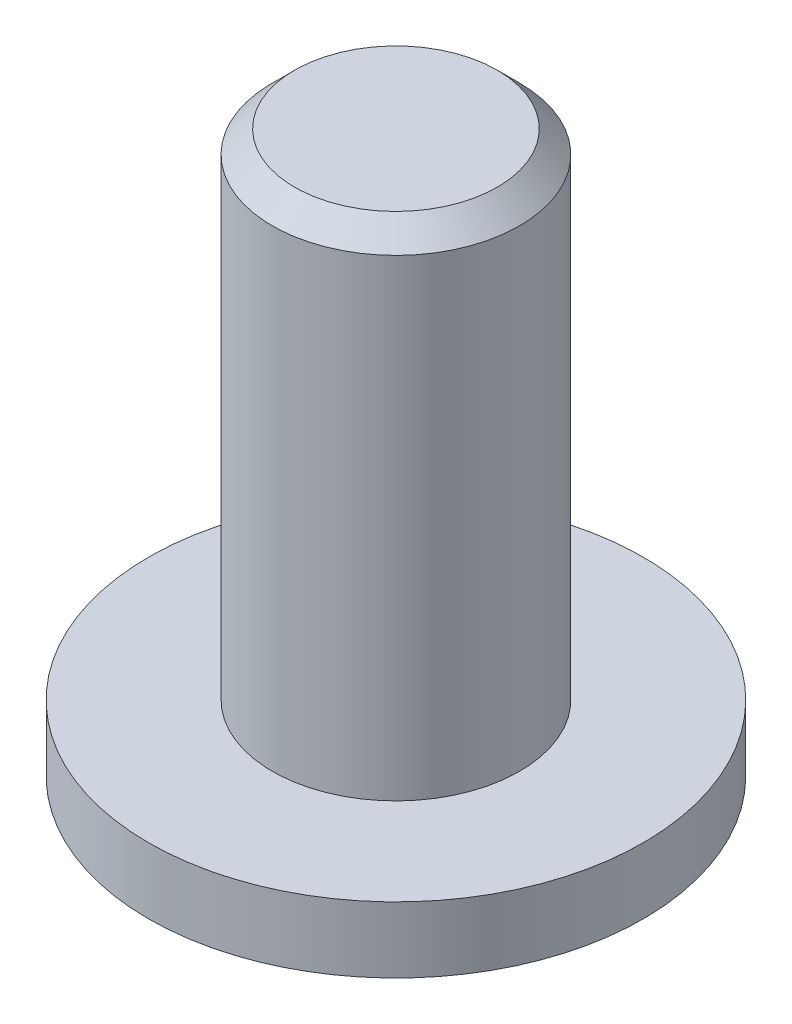
ISO-10303-21;
HEADER;
FILE_DESCRIPTION(('STEP AP214'),'2;1');
FILE_NAME('part.step','',(''),(''),'','','');
FILE_SCHEMA(('AUTOMOTIVE_DESIGN { 1 0 10303 214 1 1 1 1 }'));
ENDSEC;
DATA;
#1=APPLICATION_CONTEXT('core data for automotive mechanical design processes');
#2=APPLICATION_PROTOCOL_DEFINITION('international standard','automotive_design',2000,#1);
#3=PRODUCT_CONTEXT('',#1,'mechanical');
#4=PRODUCT('Part','Part','',(#3));
#5=PRODUCT_RELATED_PRODUCT_CATEGORY('part','',(#4));
#6=PRODUCT_DEFINITION_FORMATION('','',#4);
#7=PRODUCT_DEFINITION_CONTEXT('part definition',#1,'design');
#8=PRODUCT_DEFINITION('design','',#6,#7);
#9=PRODUCT_DEFINITION_SHAPE('','',#8);
#10=(LENGTH_UNIT() NAMED_UNIT(*) SI_UNIT(.MILLI.,.METRE.));
#11=(NAMED_UNIT(*) PLANE_ANGLE_UNIT() SI_UNIT($,.RADIAN.));
#12=(NAMED_UNIT(*) SI_UNIT($,.STERADIAN.) SOLID_ANGLE_UNIT());
#13=UNCERTAINTY_MEASURE_WITH_UNIT(LENGTH_MEASURE(1.E-05),#10,'distance_accuracy_value','');
#14=(GEOMETRIC_REPRESENTATION_CONTEXT(3) GLOBAL_UNCERTAINTY_ASSIGNED_CONTEXT((#13)) GLOBAL_UNIT_ASSIGNED_CONTEXT((#10,
#11,#12)) REPRESENTATION_CONTEXT('',''));
#15=CARTESIAN_POINT('',(0.,0.,0.));
#16=DIRECTION('',(0.,0.,1.));
#17=DIRECTION('',(1.,0.,0.));
#18=AXIS2_PLACEMENT_3D('',#15,#16,#17);
#19=CARTESIAN_POINT('',(0.,0.8,0.));
#20=DIRECTION('',(0.,-1.,0.));
#21=DIRECTION('',(0.,0.,-1.));
#22=AXIS2_PLACEMENT_3D('',#19,#20,#21);
#23=CYLINDRICAL_SURFACE('',#22,3.);
#24=CARTESIAN_POINT('',(0.,0.8,0.));
#25=DIRECTION('',(0.,1.,0.));
#26=DIRECTION('',(0.,0.,1.));
#27=AXIS2_PLACEMENT_3D('',#24,#25,#26);
#28=CIRCLE('',#27,3.);
#29=CARTESIAN_POINT('',(0.,0.8,3.));
#30=VERTEX_POINT('',#29);
#31=EDGE_CURVE('E11',#30,#30,#28,.T.);
#32=ORIENTED_EDGE('',*,*,#31,.F.);
#33=EDGE_LOOP('',(#32));
#34=FACE_BOUND('',#33,.T.);
#35=CARTESIAN_POINT('',(0.,0.,0.));
#36=DIRECTION('',(0.,1.,0.));
#37=DIRECTION('',(0.,0.,1.));
#38=AXIS2_PLACEMENT_3D('',#35,#36,#37);
#39=CIRCLE('',#38,3.);
#40=CARTESIAN_POINT('',(0.,0.,3.));
#41=VERTEX_POINT('',#40);
#42=EDGE_CURVE('E52',#41,#41,#39,.T.);
#43=ORIENTED_EDGE('',*,*,#42,.T.);
#44=EDGE_LOOP('',(#43));
#45=FACE_BOUND('',#44,.T.);
#46=ADVANCED_FACE('F49',(#34,#45),#23,.T.);
#47=CARTESIAN_POINT('',(0.,0.8,0.));
#48=DIRECTION('',(0.,1.,0.));
#49=DIRECTION('',(0.,0.,1.));
#50=AXIS2_PLACEMENT_3D('',#47,#48,#49);
#51=PLANE('',#50);
#52=CARTESIAN_POINT('',(0.,0.8,0.));
#53=DIRECTION('',(0.,-1.,0.));
#54=DIRECTION('',(0.,0.,-1.));
#55=AXIS2_PLACEMENT_3D('',#52,#53,#54);
#56=CIRCLE('',#55,1.5);
#57=CARTESIAN_POINT('',(0.,0.8,-1.5));
#58=VERTEX_POINT('',#57);
#59=EDGE_CURVE('E150',#58,#58,#56,.T.);
#60=ORIENTED_EDGE('',*,*,#59,.T.);
#61=EDGE_LOOP('',(#60));
#62=FACE_BOUND('',#61,.T.);
#63=ORIENTED_EDGE('',*,*,#31,.T.);
#64=EDGE_LOOP('',(#63));
#65=FACE_BOUND('',#64,.T.);
#66=ADVANCED_FACE('F172',(#62,#65),#51,.T.);
#67=CARTESIAN_POINT('',(0.,0.,0.));
#68=DIRECTION('',(0.,1.,0.));
#69=DIRECTION('',(0.,0.,1.));
#70=AXIS2_PLACEMENT_3D('',#67,#68,#69);
#71=PLANE('',#70);
#72=DIRECTION('',(-0.5,0.,0.866025403784438));
#73=VECTOR('',#72,1.);
#74=CARTESIAN_POINT('',(1.15470053837925,0.,0.));
#75=LINE('',#74,#73);
#76=CARTESIAN_POINT('',(1.15470053837925,0.,0.));
#77=VERTEX_POINT('',#76);
#78=CARTESIAN_POINT('',(0.577350269189625,0.,1.));
#79=VERTEX_POINT('',#78);
#80=EDGE_CURVE('E137',#77,#79,#75,.T.);
#81=ORIENTED_EDGE('',*,*,#80,.F.);
#82=DIRECTION('',(0.5,0.,0.866025403784439));
#83=VECTOR('',#82,1.);
#84=CARTESIAN_POINT('',(0.577350269189626,0.,-1.));
#85=LINE('',#84,#83);
#86=CARTESIAN_POINT('',(0.577350269189626,0.,-1.));
#87=VERTEX_POINT('',#86);
#88=EDGE_CURVE('E63',#87,#77,#85,.T.);
#89=ORIENTED_EDGE('',*,*,#88,.F.);
#90=DIRECTION('',(1.,0.,0.));
#91=VECTOR('',#90,1.);
#92=CARTESIAN_POINT('',(-0.577350269189626,0.,-1.));
#93=LINE('',#92,#91);
#94=CARTESIAN_POINT('',(-0.577350269189626,0.,-1.));
#95=VERTEX_POINT('',#94);
#96=EDGE_CURVE('E146',#95,#87,#93,.T.);
#97=ORIENTED_EDGE('',*,*,#96,.F.);
#98=DIRECTION('',(0.5,0.,-0.866025403784439));
#99=VECTOR('',#98,1.);
#100=CARTESIAN_POINT('',(-1.15470053837925,0.,0.));
#101=LINE('',#100,#99);
#102=CARTESIAN_POINT('',(-1.15470053837925,0.,0.));
#103=VERTEX_POINT('',#102);
#104=EDGE_CURVE('E144',#103,#95,#101,.T.);
#105=ORIENTED_EDGE('',*,*,#104,.F.);
#106=DIRECTION('',(-0.5,0.,-0.866025403784439));
#107=VECTOR('',#106,1.);
#108=CARTESIAN_POINT('',(-0.577350269189626,0.,1.));
#109=LINE('',#108,#107);
#110=CARTESIAN_POINT('',(-0.577350269189626,0.,1.));
#111=VERTEX_POINT('',#110);
#112=EDGE_CURVE('E111',#111,#103,#109,.T.);
#113=ORIENTED_EDGE('',*,*,#112,.F.);
#114=DIRECTION('',(-1.,0.,0.));
#115=VECTOR('',#114,1.);
#116=CARTESIAN_POINT('',(0.577350269189625,0.,1.));
#117=LINE('',#116,#115);
#118=EDGE_CURVE('E140',#79,#111,#117,.T.);
#119=ORIENTED_EDGE('',*,*,#118,.F.);
#120=EDGE_LOOP('',(#81,#89,#97,#105,#113,#119));
#121=FACE_BOUND('',#120,.T.);
#122=ORIENTED_EDGE('',*,*,#42,.F.);
#123=EDGE_LOOP('',(#122));
#124=FACE_BOUND('',#123,.T.);
#125=ADVANCED_FACE('F169',(#121,#124),#71,.F.);
#126=CARTESIAN_POINT('',(1.2295,6.8,0.));
#127=DIRECTION('',(0.,1.,0.));
#128=DIRECTION('',(0.,0.,1.));
#129=AXIS2_PLACEMENT_3D('',#126,#127,#128);
#130=PLANE('',#129);
#131=CARTESIAN_POINT('',(0.,6.8,0.));
#132=DIRECTION('',(0.,-1.,0.));
#133=DIRECTION('',(0.,0.,-1.));
#134=AXIS2_PLACEMENT_3D('',#131,#132,#133);
#135=CIRCLE('',#134,1.2295);
#136=CARTESIAN_POINT('',(0.,6.8,-1.2295));
#137=VERTEX_POINT('',#136);
#138=EDGE_CURVE('E161',#137,#137,#135,.T.);
#139=ORIENTED_EDGE('',*,*,#138,.F.);
#140=EDGE_LOOP('',(#139));
#141=FACE_BOUND('',#140,.T.);
#142=ADVANCED_FACE('F171',(#141),#130,.T.);
#143=CARTESIAN_POINT('',(0.,6.5295,0.));
#144=DIRECTION('',(0.,-1.,0.));
#145=DIRECTION('',(0.,0.,-1.));
#146=AXIS2_PLACEMENT_3D('',#143,#144,#145);
#147=CONICAL_SURFACE('',#146,1.5,0.785398163397452);
#148=ORIENTED_EDGE('',*,*,#138,.T.);
#149=EDGE_LOOP('',(#148));
#150=FACE_BOUND('',#149,.T.);
#151=CARTESIAN_POINT('',(0.,6.5295,0.));
#152=DIRECTION('',(0.,-1.,0.));
#153=DIRECTION('',(0.,0.,-1.));
#154=AXIS2_PLACEMENT_3D('',#151,#152,#153);
#155=CIRCLE('',#154,1.5);
#156=CARTESIAN_POINT('',(0.,6.5295,-1.5));
#157=VERTEX_POINT('',#156);
#158=EDGE_CURVE('E158',#157,#157,#155,.T.);
#159=ORIENTED_EDGE('',*,*,#158,.F.);
#160=EDGE_LOOP('',(#159));
#161=FACE_BOUND('',#160,.T.);
#162=ADVANCED_FACE('F179',(#150,#161),#147,.T.);
#163=CARTESIAN_POINT('',(0.,0.8,0.));
#164=DIRECTION('',(0.,-1.,0.));
#165=DIRECTION('',(0.,0.,-1.));
#166=AXIS2_PLACEMENT_3D('',#163,#164,#165);
#167=CYLINDRICAL_SURFACE('',#166,1.5);
#168=ORIENTED_EDGE('',*,*,#158,.T.);
#169=EDGE_LOOP('',(#168));
#170=FACE_BOUND('',#169,.T.);
#171=ORIENTED_EDGE('',*,*,#59,.F.);
#172=EDGE_LOOP('',(#171));
#173=FACE_BOUND('',#172,.T.);
#174=ADVANCED_FACE('F212',(#170,#173),#167,.T.);
#175=CARTESIAN_POINT('',(0.577350269189626,0.5,-1.));
#176=DIRECTION('',(0.866025403784439,0.,-0.5));
#177=DIRECTION('',(-0.5,0.,-0.866025403784439));
#178=AXIS2_PLACEMENT_3D('',#175,#176,#177);
#179=PLANE('',#178);
#180=ORIENTED_EDGE('',*,*,#88,.T.);
#181=DIRECTION('',(0.,-1.,0.));
#182=VECTOR('',#181,1.);
#183=CARTESIAN_POINT('',(1.15470053837925,0.5,0.));
#184=LINE('',#183,#182);
#185=CARTESIAN_POINT('',(1.15470053837925,0.5,0.));
#186=VERTEX_POINT('',#185);
#187=EDGE_CURVE('E93',#186,#77,#184,.T.);
#188=ORIENTED_EDGE('',*,*,#187,.F.);
#189=DIRECTION('',(0.5,0.,0.866025403784439));
#190=VECTOR('',#189,1.);
#191=CARTESIAN_POINT('',(0.577350269189626,0.5,-1.));
#192=LINE('',#191,#190);
#193=CARTESIAN_POINT('',(0.577350269189626,0.5,-1.));
#194=VERTEX_POINT('',#193);
#195=EDGE_CURVE('E148',#194,#186,#192,.T.);
#196=ORIENTED_EDGE('',*,*,#195,.F.);
#197=DIRECTION('',(0.,-1.,0.));
#198=VECTOR('',#197,1.);
#199=CARTESIAN_POINT('',(0.577350269189626,0.5,-1.));
#200=LINE('',#199,#198);
#201=EDGE_CURVE('E71',#194,#87,#200,.T.);
#202=ORIENTED_EDGE('',*,*,#201,.T.);
#203=EDGE_LOOP('',(#180,#188,#196,#202));
#204=FACE_BOUND('',#203,.T.);
#205=ADVANCED_FACE('F222',(#204),#179,.F.);
#206=CARTESIAN_POINT('',(-0.577350269189626,0.5,-1.));
#207=DIRECTION('',(0.,0.,-1.));
#208=DIRECTION('',(-1.,0.,0.));
#209=AXIS2_PLACEMENT_3D('',#206,#207,#208);
#210=PLANE('',#209);
#211=ORIENTED_EDGE('',*,*,#96,.T.);
#212=ORIENTED_EDGE('',*,*,#201,.F.);
#213=DIRECTION('',(1.,0.,0.));
#214=VECTOR('',#213,1.);
#215=CARTESIAN_POINT('',(-0.577350269189626,0.5,-1.));
#216=LINE('',#215,#214);
#217=CARTESIAN_POINT('',(-0.577350269189626,0.5,-1.));
#218=VERTEX_POINT('',#217);
#219=EDGE_CURVE('E123',#218,#194,#216,.T.);
#220=ORIENTED_EDGE('',*,*,#219,.F.);
#221=DIRECTION('',(0.,-1.,0.));
#222=VECTOR('',#221,1.);
#223=CARTESIAN_POINT('',(-0.577350269189626,0.5,-1.));
#224=LINE('',#223,#222);
#225=EDGE_CURVE('E115',#218,#95,#224,.T.);
#226=ORIENTED_EDGE('',*,*,#225,.T.);
#227=EDGE_LOOP('',(#211,#212,#220,#226));
#228=FACE_BOUND('',#227,.T.);
#229=ADVANCED_FACE('F241',(#228),#210,.F.);
#230=CARTESIAN_POINT('',(-1.15470053837925,0.5,0.));
#231=DIRECTION('',(-0.866025403784439,0.,-0.5));
#232=DIRECTION('',(-0.5,0.,0.866025403784439));
#233=AXIS2_PLACEMENT_3D('',#230,#231,#232);
#234=PLANE('',#233);
#235=ORIENTED_EDGE('',*,*,#104,.T.);
#236=ORIENTED_EDGE('',*,*,#225,.F.);
#237=DIRECTION('',(0.5,0.,-0.866025403784439));
#238=VECTOR('',#237,1.);
#239=CARTESIAN_POINT('',(-1.15470053837925,0.5,0.));
#240=LINE('',#239,#238);
#241=CARTESIAN_POINT('',(-1.15470053837925,0.5,0.));
#242=VERTEX_POINT('',#241);
#243=EDGE_CURVE('E119',#242,#218,#240,.T.);
#244=ORIENTED_EDGE('',*,*,#243,.F.);
#245=DIRECTION('',(0.,-1.,0.));
#246=VECTOR('',#245,1.);
#247=CARTESIAN_POINT('',(-1.15470053837925,0.5,0.));
#248=LINE('',#247,#246);
#249=EDGE_CURVE('E104',#242,#103,#248,.T.);
#250=ORIENTED_EDGE('',*,*,#249,.T.);
#251=EDGE_LOOP('',(#235,#236,#244,#250));
#252=FACE_BOUND('',#251,.T.);
#253=ADVANCED_FACE('F120',(#252),#234,.F.);
#254=CARTESIAN_POINT('',(-0.577350269189626,0.5,1.));
#255=DIRECTION('',(-0.866025403784439,0.,0.5));
#256=DIRECTION('',(0.5,0.,0.866025403784439));
#257=AXIS2_PLACEMENT_3D('',#254,#255,#256);
#258=PLANE('',#257);
#259=ORIENTED_EDGE('',*,*,#112,.T.);
#260=ORIENTED_EDGE('',*,*,#249,.F.);
#261=DIRECTION('',(-0.5,0.,-0.866025403784439));
#262=VECTOR('',#261,1.);
#263=CARTESIAN_POINT('',(-0.577350269189626,0.5,1.));
#264=LINE('',#263,#262);
#265=CARTESIAN_POINT('',(-0.577350269189626,0.5,1.));
#266=VERTEX_POINT('',#265);
#267=EDGE_CURVE('E108',#266,#242,#264,.T.);
#268=ORIENTED_EDGE('',*,*,#267,.F.);
#269=DIRECTION('',(0.,-1.,0.));
#270=VECTOR('',#269,1.);
#271=CARTESIAN_POINT('',(-0.577350269189626,0.5,1.));
#272=LINE('',#271,#270);
#273=EDGE_CURVE('E116',#266,#111,#272,.T.);
#274=ORIENTED_EDGE('',*,*,#273,.T.);
#275=EDGE_LOOP('',(#259,#260,#268,#274));
#276=FACE_BOUND('',#275,.T.);
#277=ADVANCED_FACE('F106',(#276),#258,.F.);
#278=CARTESIAN_POINT('',(0.577350269189625,0.5,1.));
#279=DIRECTION('',(0.,0.,1.));
#280=DIRECTION('',(1.,0.,0.));
#281=AXIS2_PLACEMENT_3D('',#278,#279,#280);
#282=PLANE('',#281);
#283=ORIENTED_EDGE('',*,*,#118,.T.);
#284=ORIENTED_EDGE('',*,*,#273,.F.);
#285=DIRECTION('',(-1.,0.,0.));
#286=VECTOR('',#285,1.);
#287=CARTESIAN_POINT('',(0.577350269189625,0.5,1.));
#288=LINE('',#287,#286);
#289=CARTESIAN_POINT('',(0.577350269189625,0.5,1.));
#290=VERTEX_POINT('',#289);
#291=EDGE_CURVE('E129',#290,#266,#288,.T.);
#292=ORIENTED_EDGE('',*,*,#291,.F.);
#293=DIRECTION('',(0.,-1.,0.));
#294=VECTOR('',#293,1.);
#295=CARTESIAN_POINT('',(0.577350269189625,0.5,1.));
#296=LINE('',#295,#294);
#297=EDGE_CURVE('E153',#290,#79,#296,.T.);
#298=ORIENTED_EDGE('',*,*,#297,.T.);
#299=EDGE_LOOP('',(#283,#284,#292,#298));
#300=FACE_BOUND('',#299,.T.);
#301=ADVANCED_FACE('F266',(#300),#282,.F.);
#302=CARTESIAN_POINT('',(1.15470053837925,0.5,0.));
#303=DIRECTION('',(0.866025403784439,0.,0.5));
#304=DIRECTION('',(0.5,0.,-0.866025403784438));
#305=AXIS2_PLACEMENT_3D('',#302,#303,#304);
#306=PLANE('',#305);
#307=ORIENTED_EDGE('',*,*,#80,.T.);
#308=ORIENTED_EDGE('',*,*,#297,.F.);
#309=DIRECTION('',(-0.5,0.,0.866025403784438));
#310=VECTOR('',#309,1.);
#311=CARTESIAN_POINT('',(1.15470053837925,0.5,0.));
#312=LINE('',#311,#310);
#313=EDGE_CURVE('E131',#186,#290,#312,.T.);
#314=ORIENTED_EDGE('',*,*,#313,.F.);
#315=ORIENTED_EDGE('',*,*,#187,.T.);
#316=EDGE_LOOP('',(#307,#308,#314,#315));
#317=FACE_BOUND('',#316,.T.);
#318=ADVANCED_FACE('F275',(#317),#306,.F.);
#319=CARTESIAN_POINT('',(0.,0.5,0.));
#320=DIRECTION('',(0.,-1.,0.));
#321=DIRECTION('',(0.,0.,-1.));
#322=AXIS2_PLACEMENT_3D('',#319,#320,#321);
#323=PLANE('',#322);
#324=ORIENTED_EDGE('',*,*,#195,.T.);
#325=ORIENTED_EDGE('',*,*,#313,.T.);
#326=ORIENTED_EDGE('',*,*,#291,.T.);
#327=ORIENTED_EDGE('',*,*,#267,.T.);
#328=ORIENTED_EDGE('',*,*,#243,.T.);
#329=ORIENTED_EDGE('',*,*,#219,.T.);
#330=EDGE_LOOP('',(#324,#325,#326,#327,#328,#329));
#331=FACE_BOUND('',#330,.T.);
#332=ADVANCED_FACE('F126',(#331),#323,.T.);
#333=CLOSED_SHELL('',(#46,#66,#125,#142,#162,#174,#205,#229,#253,#277,#301,#318,#332));
#334=MANIFOLD_SOLID_BREP('B2',#333);
#335=ADVANCED_BREP_SHAPE_REPRESENTATION('',(#18,#334),#14);
#336=SHAPE_DEFINITION_REPRESENTATION(#9,#335);
ENDSEC;
END-ISO-10303-21;
